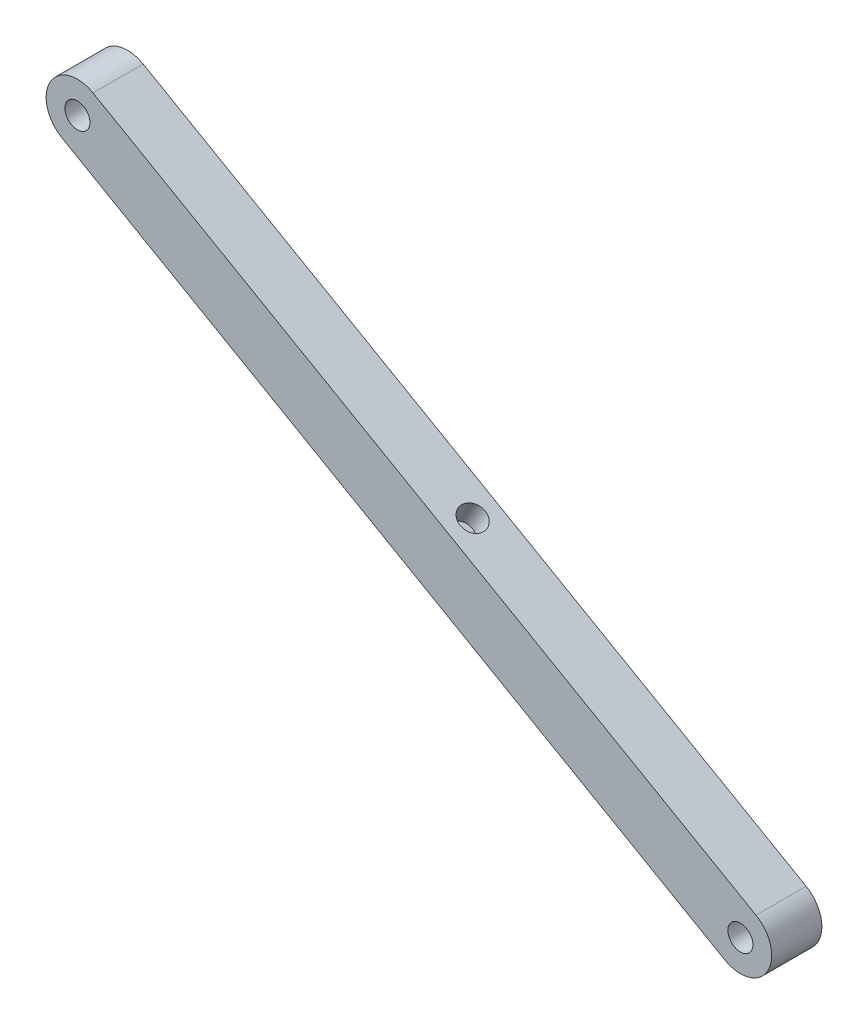
ISO-10303-21;
HEADER;
FILE_DESCRIPTION(('STEP AP214'),'2;1');
FILE_NAME('part.step','',(''),(''),'','','');
FILE_SCHEMA(('AUTOMOTIVE_DESIGN { 1 0 10303 214 1 1 1 1 }'));
ENDSEC;
DATA;
#1=APPLICATION_CONTEXT('core data for automotive mechanical design processes');
#2=APPLICATION_PROTOCOL_DEFINITION('international standard','automotive_design',2000,#1);
#3=PRODUCT_CONTEXT('',#1,'mechanical');
#4=PRODUCT('Part','Part','',(#3));
#5=PRODUCT_RELATED_PRODUCT_CATEGORY('part','',(#4));
#6=PRODUCT_DEFINITION_FORMATION('','',#4);
#7=PRODUCT_DEFINITION_CONTEXT('part definition',#1,'design');
#8=PRODUCT_DEFINITION('design','',#6,#7);
#9=PRODUCT_DEFINITION_SHAPE('','',#8);
#10=(LENGTH_UNIT() NAMED_UNIT(*) SI_UNIT(.MILLI.,.METRE.));
#11=(NAMED_UNIT(*) PLANE_ANGLE_UNIT() SI_UNIT($,.RADIAN.));
#12=(NAMED_UNIT(*) SI_UNIT($,.STERADIAN.) SOLID_ANGLE_UNIT());
#13=UNCERTAINTY_MEASURE_WITH_UNIT(LENGTH_MEASURE(1.E-05),#10,'distance_accuracy_value','');
#14=(GEOMETRIC_REPRESENTATION_CONTEXT(3) GLOBAL_UNCERTAINTY_ASSIGNED_CONTEXT((#13)) GLOBAL_UNIT_ASSIGNED_CONTEXT((#10,
#11,#12)) REPRESENTATION_CONTEXT('',''));
#15=CARTESIAN_POINT('',(0.,0.,0.));
#16=DIRECTION('',(0.,0.,1.));
#17=DIRECTION('',(1.,0.,0.));
#18=AXIS2_PLACEMENT_3D('',#15,#16,#17);
#19=CARTESIAN_POINT('',(-58.1684859754467,61.412693648505,4.));
#20=DIRECTION('',(0.,0.,1.));
#21=DIRECTION('',(1.,0.,0.));
#22=AXIS2_PLACEMENT_3D('',#19,#20,#21);
#23=PLANE('',#22);
#24=CARTESIAN_POINT('',(-58.1684859754467,61.412693648505,4.));
#25=DIRECTION('',(0.,0.,1.));
#26=DIRECTION('',(1.,0.,0.));
#27=AXIS2_PLACEMENT_3D('',#24,#25,#26);
#28=CIRCLE('',#27,0.999999999999998);
#29=CARTESIAN_POINT('',(-57.1684859754467,61.412693648505,4.));
#30=VERTEX_POINT('',#29);
#31=EDGE_CURVE('E112',#30,#30,#28,.T.);
#32=ORIENTED_EDGE('',*,*,#31,.F.);
#33=EDGE_LOOP('',(#32));
#34=FACE_BOUND('',#33,.T.);
#35=CARTESIAN_POINT('',(-58.1684859754467,61.412693648505,4.));
#36=DIRECTION('',(0.,0.,1.));
#37=DIRECTION('',(1.,0.,0.));
#38=AXIS2_PLACEMENT_3D('',#35,#36,#37);
#39=CIRCLE('',#38,2.50000000000003);
#40=CARTESIAN_POINT('',(-56.923893132049,63.5808699914632,4.));
#41=VERTEX_POINT('',#40);
#42=CARTESIAN_POINT('',(-59.4130788188444,59.2445173055469,4.));
#43=VERTEX_POINT('',#42);
#44=EDGE_CURVE('E92',#41,#43,#39,.T.);
#45=ORIENTED_EDGE('',*,*,#44,.T.);
#46=DIRECTION('',(0.867270537183246,-0.497837137359081,0.));
#47=VECTOR('',#46,1.);
#48=CARTESIAN_POINT('',(-59.4130788188444,59.2445173055469,4.));
#49=LINE('',#48,#47);
#50=CARTESIAN_POINT('',(-6.50957605066647,28.876451926643,4.));
#51=VERTEX_POINT('',#50);
#52=EDGE_CURVE('E87',#43,#51,#49,.T.);
#53=ORIENTED_EDGE('',*,*,#52,.T.);
#54=CARTESIAN_POINT('',(-5.26498320726877,31.0446282696011,4.));
#55=DIRECTION('',(0.,0.,1.));
#56=DIRECTION('',(1.,0.,0.));
#57=AXIS2_PLACEMENT_3D('',#54,#55,#56);
#58=CIRCLE('',#57,2.5);
#59=CARTESIAN_POINT('',(-4.02039036387106,33.2128046125592,4.));
#60=VERTEX_POINT('',#59);
#61=EDGE_CURVE('E90',#51,#60,#58,.T.);
#62=ORIENTED_EDGE('',*,*,#61,.T.);
#63=DIRECTION('',(-0.867270537183245,0.497837137359082,0.));
#64=VECTOR('',#63,1.);
#65=CARTESIAN_POINT('',(-56.923893132049,63.5808699914632,4.));
#66=LINE('',#65,#64);
#67=EDGE_CURVE('E57',#60,#41,#66,.T.);
#68=ORIENTED_EDGE('',*,*,#67,.T.);
#69=EDGE_LOOP('',(#45,#53,#62,#68));
#70=FACE_BOUND('',#69,.T.);
#71=CARTESIAN_POINT('',(-5.26498320726877,31.0446282696011,4.));
#72=DIRECTION('',(0.,0.,1.));
#73=DIRECTION('',(1.,0.,0.));
#74=AXIS2_PLACEMENT_3D('',#71,#72,#73);
#75=CIRCLE('',#74,1.);
#76=CARTESIAN_POINT('',(-4.26498320726877,31.0446282696011,4.));
#77=VERTEX_POINT('',#76);
#78=EDGE_CURVE('E134',#77,#77,#75,.T.);
#79=ORIENTED_EDGE('',*,*,#78,.F.);
#80=EDGE_LOOP('',(#79));
#81=FACE_BOUND('',#80,.T.);
#82=ADVANCED_FACE('F39',(#34,#70,#81),#23,.T.);
#83=CARTESIAN_POINT('',(-58.1684859754467,61.412693648505,0.));
#84=DIRECTION('',(0.,0.,1.));
#85=DIRECTION('',(1.,0.,0.));
#86=AXIS2_PLACEMENT_3D('',#83,#84,#85);
#87=PLANE('',#86);
#88=CARTESIAN_POINT('',(-58.1684859754467,61.412693648505,0.));
#89=DIRECTION('',(0.,0.,1.));
#90=DIRECTION('',(1.,0.,0.));
#91=AXIS2_PLACEMENT_3D('',#88,#89,#90);
#92=CIRCLE('',#91,2.50000000000003);
#93=CARTESIAN_POINT('',(-56.923893132049,63.5808699914632,0.));
#94=VERTEX_POINT('',#93);
#95=CARTESIAN_POINT('',(-59.4130788188444,59.2445173055469,0.));
#96=VERTEX_POINT('',#95);
#97=EDGE_CURVE('E108',#94,#96,#92,.T.);
#98=ORIENTED_EDGE('',*,*,#97,.F.);
#99=DIRECTION('',(-0.867270537183245,0.497837137359082,0.));
#100=VECTOR('',#99,1.);
#101=CARTESIAN_POINT('',(-56.923893132049,63.5808699914632,0.));
#102=LINE('',#101,#100);
#103=CARTESIAN_POINT('',(-4.02039036387106,33.2128046125592,0.));
#104=VERTEX_POINT('',#103);
#105=EDGE_CURVE('E80',#104,#94,#102,.T.);
#106=ORIENTED_EDGE('',*,*,#105,.F.);
#107=CARTESIAN_POINT('',(-5.26498320726877,31.0446282696011,0.));
#108=DIRECTION('',(0.,0.,1.));
#109=DIRECTION('',(1.,0.,0.));
#110=AXIS2_PLACEMENT_3D('',#107,#108,#109);
#111=CIRCLE('',#110,2.5);
#112=CARTESIAN_POINT('',(-6.50957605066647,28.876451926643,0.));
#113=VERTEX_POINT('',#112);
#114=EDGE_CURVE('E74',#113,#104,#111,.T.);
#115=ORIENTED_EDGE('',*,*,#114,.F.);
#116=DIRECTION('',(0.867270537183246,-0.497837137359081,0.));
#117=VECTOR('',#116,1.);
#118=CARTESIAN_POINT('',(-59.4130788188444,59.2445173055469,0.));
#119=LINE('',#118,#117);
#120=EDGE_CURVE('E97',#96,#113,#119,.T.);
#121=ORIENTED_EDGE('',*,*,#120,.F.);
#122=EDGE_LOOP('',(#98,#106,#115,#121));
#123=FACE_BOUND('',#122,.T.);
#124=CARTESIAN_POINT('',(-58.1684859754467,61.412693648505,0.));
#125=DIRECTION('',(0.,0.,1.));
#126=DIRECTION('',(1.,0.,0.));
#127=AXIS2_PLACEMENT_3D('',#124,#125,#126);
#128=CIRCLE('',#127,0.999999999999998);
#129=CARTESIAN_POINT('',(-57.1684859754467,61.412693648505,0.));
#130=VERTEX_POINT('',#129);
#131=EDGE_CURVE('E130',#130,#130,#128,.T.);
#132=ORIENTED_EDGE('',*,*,#131,.T.);
#133=EDGE_LOOP('',(#132));
#134=FACE_BOUND('',#133,.T.);
#135=CARTESIAN_POINT('',(-5.26498320726877,31.0446282696011,0.));
#136=DIRECTION('',(0.,0.,1.));
#137=DIRECTION('',(1.,0.,0.));
#138=AXIS2_PLACEMENT_3D('',#135,#136,#137);
#139=CIRCLE('',#138,1.);
#140=CARTESIAN_POINT('',(-4.26498320726877,31.0446282696011,0.));
#141=VERTEX_POINT('',#140);
#142=EDGE_CURVE('E138',#141,#141,#139,.T.);
#143=ORIENTED_EDGE('',*,*,#142,.T.);
#144=EDGE_LOOP('',(#143));
#145=FACE_BOUND('',#144,.T.);
#146=ADVANCED_FACE('F125',(#123,#134,#145),#87,.F.);
#147=CARTESIAN_POINT('',(-58.1684859754467,61.412693648505,4.));
#148=DIRECTION('',(0.,0.,-1.));
#149=DIRECTION('',(-1.,0.,0.));
#150=AXIS2_PLACEMENT_3D('',#147,#148,#149);
#151=CYLINDRICAL_SURFACE('',#150,2.50000000000003);
#152=ORIENTED_EDGE('',*,*,#97,.T.);
#153=DIRECTION('',(0.,0.,-1.));
#154=VECTOR('',#153,1.);
#155=CARTESIAN_POINT('',(-59.4130788188444,59.2445173055469,4.));
#156=LINE('',#155,#154);
#157=EDGE_CURVE('E11',#43,#96,#156,.T.);
#158=ORIENTED_EDGE('',*,*,#157,.F.);
#159=ORIENTED_EDGE('',*,*,#44,.F.);
#160=DIRECTION('',(0.,0.,-1.));
#161=VECTOR('',#160,1.);
#162=CARTESIAN_POINT('',(-56.923893132049,63.5808699914632,4.));
#163=LINE('',#162,#161);
#164=EDGE_CURVE('E104',#41,#94,#163,.T.);
#165=ORIENTED_EDGE('',*,*,#164,.T.);
#166=EDGE_LOOP('',(#152,#158,#159,#165));
#167=FACE_BOUND('',#166,.T.);
#168=ADVANCED_FACE('F41',(#167),#151,.T.);
#169=CARTESIAN_POINT('',(-59.4130788188444,59.2445173055469,4.));
#170=DIRECTION('',(0.497837137359081,0.867270537183246,0.));
#171=DIRECTION('',(-0.867270537183246,0.497837137359081,0.));
#172=AXIS2_PLACEMENT_3D('',#169,#170,#171);
#173=PLANE('',#172);
#174=ORIENTED_EDGE('',*,*,#120,.T.);
#175=DIRECTION('',(0.,0.,-1.));
#176=VECTOR('',#175,1.);
#177=CARTESIAN_POINT('',(-6.50957605066647,28.876451926643,4.));
#178=LINE('',#177,#176);
#179=EDGE_CURVE('E49',#51,#113,#178,.T.);
#180=ORIENTED_EDGE('',*,*,#179,.F.);
#181=ORIENTED_EDGE('',*,*,#52,.F.);
#182=ORIENTED_EDGE('',*,*,#157,.T.);
#183=EDGE_LOOP('',(#174,#180,#181,#182));
#184=FACE_BOUND('',#183,.T.);
#185=ADVANCED_FACE('F96',(#184),#173,.F.);
#186=CARTESIAN_POINT('',(-5.26498320726877,31.0446282696011,4.));
#187=DIRECTION('',(0.,0.,-1.));
#188=DIRECTION('',(-1.,0.,0.));
#189=AXIS2_PLACEMENT_3D('',#186,#187,#188);
#190=CYLINDRICAL_SURFACE('',#189,2.5);
#191=ORIENTED_EDGE('',*,*,#114,.T.);
#192=DIRECTION('',(0.,0.,-1.));
#193=VECTOR('',#192,1.);
#194=CARTESIAN_POINT('',(-4.02039036387106,33.2128046125592,4.));
#195=LINE('',#194,#193);
#196=EDGE_CURVE('E99',#60,#104,#195,.T.);
#197=ORIENTED_EDGE('',*,*,#196,.F.);
#198=ORIENTED_EDGE('',*,*,#61,.F.);
#199=ORIENTED_EDGE('',*,*,#179,.T.);
#200=EDGE_LOOP('',(#191,#197,#198,#199));
#201=FACE_BOUND('',#200,.T.);
#202=ADVANCED_FACE('F100',(#201),#190,.T.);
#203=CARTESIAN_POINT('',(-56.923893132049,63.5808699914632,4.));
#204=DIRECTION('',(-0.497837137359082,-0.867270537183245,0.));
#205=DIRECTION('',(0.867270537183245,-0.497837137359082,0.));
#206=AXIS2_PLACEMENT_3D('',#203,#204,#205);
#207=PLANE('',#206);
#208=CARTESIAN_POINT('',(-28.635584917886,47.3426031781923,2.));
#209=DIRECTION('',(0.497837137359081,0.867270537183246,0.));
#210=DIRECTION('',(-0.867270537183246,0.497837137359081,0.));
#211=AXIS2_PLACEMENT_3D('',#208,#209,#210);
#212=CIRCLE('',#211,0.999999999999996);
#213=CARTESIAN_POINT('',(-29.5028554550693,47.8404403155513,2.));
#214=VERTEX_POINT('',#213);
#215=EDGE_CURVE('E146',#214,#214,#212,.T.);
#216=ORIENTED_EDGE('',*,*,#215,.F.);
#217=EDGE_LOOP('',(#216));
#218=FACE_BOUND('',#217,.T.);
#219=ORIENTED_EDGE('',*,*,#105,.T.);
#220=ORIENTED_EDGE('',*,*,#164,.F.);
#221=ORIENTED_EDGE('',*,*,#67,.F.);
#222=ORIENTED_EDGE('',*,*,#196,.T.);
#223=EDGE_LOOP('',(#219,#220,#221,#222));
#224=FACE_BOUND('',#223,.T.);
#225=ADVANCED_FACE('F122',(#218,#224),#207,.F.);
#226=CARTESIAN_POINT('',(-58.1684859754467,61.412693648505,4.));
#227=DIRECTION('',(0.,0.,-1.));
#228=DIRECTION('',(-1.,0.,0.));
#229=AXIS2_PLACEMENT_3D('',#226,#227,#228);
#230=CYLINDRICAL_SURFACE('',#229,0.999999999999998);
#231=ORIENTED_EDGE('',*,*,#31,.T.);
#232=EDGE_LOOP('',(#231));
#233=FACE_BOUND('',#232,.T.);
#234=ORIENTED_EDGE('',*,*,#131,.F.);
#235=EDGE_LOOP('',(#234));
#236=FACE_BOUND('',#235,.T.);
#237=ADVANCED_FACE('F164',(#233,#236),#230,.F.);
#238=CARTESIAN_POINT('',(-5.26498320726877,31.0446282696011,4.));
#239=DIRECTION('',(0.,0.,-1.));
#240=DIRECTION('',(-1.,0.,0.));
#241=AXIS2_PLACEMENT_3D('',#238,#239,#240);
#242=CYLINDRICAL_SURFACE('',#241,1.);
#243=ORIENTED_EDGE('',*,*,#78,.T.);
#244=EDGE_LOOP('',(#243));
#245=FACE_BOUND('',#244,.T.);
#246=ORIENTED_EDGE('',*,*,#142,.F.);
#247=EDGE_LOOP('',(#246));
#248=FACE_BOUND('',#247,.T.);
#249=ADVANCED_FACE('F159',(#245,#248),#242,.F.);
#250=CARTESIAN_POINT('',(-29.6312591926042,45.6080621038258,2.));
#251=DIRECTION('',(0.497837137359081,0.867270537183246,0.));
#252=DIRECTION('',(-0.867270537183246,0.497837137359081,0.));
#253=AXIS2_PLACEMENT_3D('',#250,#251,#252);
#254=CYLINDRICAL_SURFACE('',#253,0.999999999999996);
#255=CARTESIAN_POINT('',(-29.6312591926042,45.6080621038258,2.));
#256=DIRECTION('',(0.497837137359081,0.867270537183246,0.));
#257=DIRECTION('',(-0.867270537183246,0.497837137359081,0.));
#258=AXIS2_PLACEMENT_3D('',#255,#256,#257);
#259=CIRCLE('',#258,0.999999999999996);
#260=CARTESIAN_POINT('',(-30.4985297297874,46.1058992411848,2.));
#261=VERTEX_POINT('',#260);
#262=EDGE_CURVE('E142',#261,#261,#259,.T.);
#263=ORIENTED_EDGE('',*,*,#262,.F.);
#264=EDGE_LOOP('',(#263));
#265=FACE_BOUND('',#264,.T.);
#266=ORIENTED_EDGE('',*,*,#215,.T.);
#267=EDGE_LOOP('',(#266));
#268=FACE_BOUND('',#267,.T.);
#269=ADVANCED_FACE('F156',(#265,#268),#254,.F.);
#270=CARTESIAN_POINT('',(-29.6312591926042,45.6080621038258,2.));
#271=DIRECTION('',(0.497837137359081,0.867270537183246,0.));
#272=DIRECTION('',(-0.867270537183246,0.497837137359081,0.));
#273=AXIS2_PLACEMENT_3D('',#270,#271,#272);
#274=PLANE('',#273);
#275=ORIENTED_EDGE('',*,*,#262,.T.);
#276=EDGE_LOOP('',(#275));
#277=FACE_BOUND('',#276,.T.);
#278=ADVANCED_FACE('F154',(#277),#274,.T.);
#279=CLOSED_SHELL('',(#82,#146,#168,#185,#202,#225,#237,#249,#269,#278));
#280=MANIFOLD_SOLID_BREP('B2',#279);
#281=ADVANCED_BREP_SHAPE_REPRESENTATION('',(#18,#280),#14);
#282=SHAPE_DEFINITION_REPRESENTATION(#9,#281);
ENDSEC;
END-ISO-10303-21;
